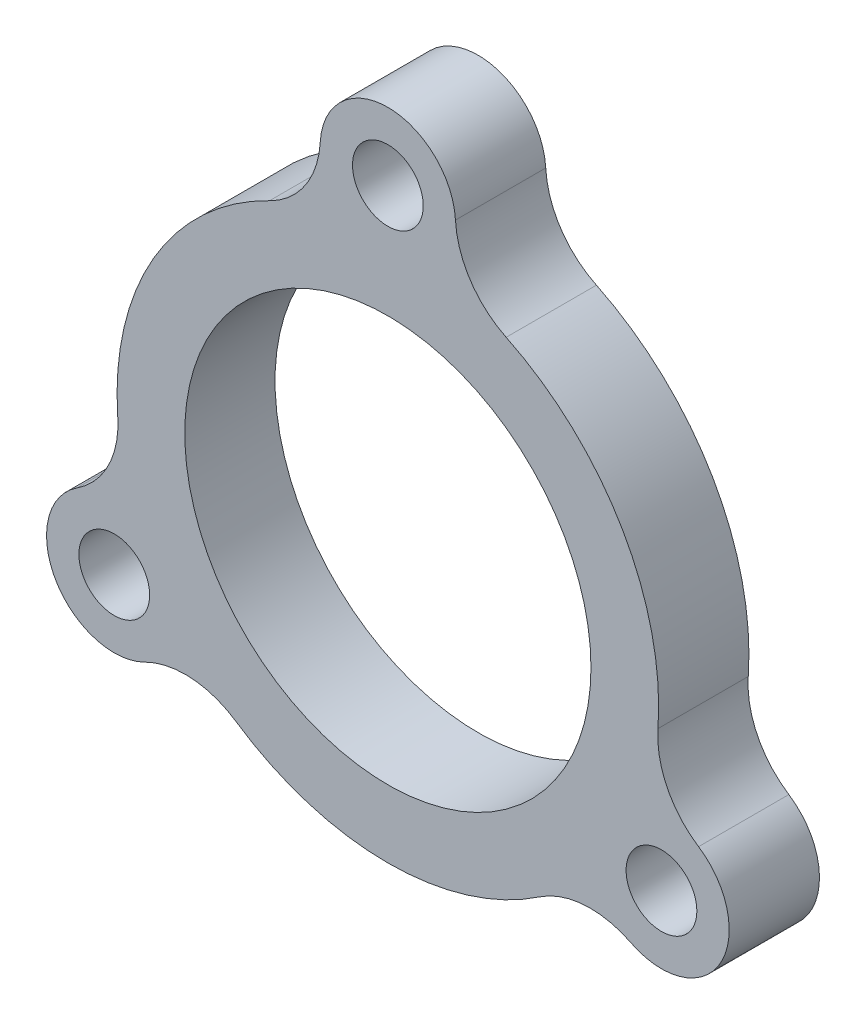
ISO-10303-21;
HEADER;
FILE_DESCRIPTION(('STEP AP214'),'2;1');
FILE_NAME('part.step','',(''),(''),'','','');
FILE_SCHEMA(('AUTOMOTIVE_DESIGN { 1 0 10303 214 1 1 1 1 }'));
ENDSEC;
DATA;
#1=APPLICATION_CONTEXT('core data for automotive mechanical design processes');
#2=APPLICATION_PROTOCOL_DEFINITION('international standard','automotive_design',2000,#1);
#3=PRODUCT_CONTEXT('',#1,'mechanical');
#4=PRODUCT('Part','Part','',(#3));
#5=PRODUCT_RELATED_PRODUCT_CATEGORY('part','',(#4));
#6=PRODUCT_DEFINITION_FORMATION('','',#4);
#7=PRODUCT_DEFINITION_CONTEXT('part definition',#1,'design');
#8=PRODUCT_DEFINITION('design','',#6,#7);
#9=PRODUCT_DEFINITION_SHAPE('','',#8);
#10=(LENGTH_UNIT() NAMED_UNIT(*) SI_UNIT(.MILLI.,.METRE.));
#11=(NAMED_UNIT(*) PLANE_ANGLE_UNIT() SI_UNIT($,.RADIAN.));
#12=(NAMED_UNIT(*) SI_UNIT($,.STERADIAN.) SOLID_ANGLE_UNIT());
#13=UNCERTAINTY_MEASURE_WITH_UNIT(LENGTH_MEASURE(1.E-05),#10,'distance_accuracy_value','');
#14=(GEOMETRIC_REPRESENTATION_CONTEXT(3) GLOBAL_UNCERTAINTY_ASSIGNED_CONTEXT((#13)) GLOBAL_UNIT_ASSIGNED_CONTEXT((#10,
#11,#12)) REPRESENTATION_CONTEXT('',''));
#15=CARTESIAN_POINT('',(0.,0.,0.));
#16=DIRECTION('',(0.,0.,1.));
#17=DIRECTION('',(1.,0.,0.));
#18=AXIS2_PLACEMENT_3D('',#15,#16,#17);
#19=CARTESIAN_POINT('',(-19.2474145991091,-11.1125,6.35));
#20=DIRECTION('',(0.,0.,-1.));
#21=DIRECTION('',(-1.,0.,0.));
#22=AXIS2_PLACEMENT_3D('',#19,#20,#21);
#23=CYLINDRICAL_SURFACE('',#22,4.7625);
#24=CARTESIAN_POINT('',(-19.2474145991091,-11.1125,6.35));
#25=DIRECTION('',(0.,0.,1.));
#26=DIRECTION('',(1.,0.,0.));
#27=AXIS2_PLACEMENT_3D('',#24,#25,#26);
#28=CIRCLE('',#27,4.7625);
#29=CARTESIAN_POINT('',(-21.8563855044312,-7.1281961630439,6.35));
#30=VERTEX_POINT('',#29);
#31=CARTESIAN_POINT('',(-17.1013917125704,-15.3640870002214,6.35));
#32=VERTEX_POINT('',#31);
#33=EDGE_CURVE('E144',#30,#32,#28,.T.);
#34=ORIENTED_EDGE('',*,*,#33,.F.);
#35=DIRECTION('',(0.,0.,-1.));
#36=VECTOR('',#35,1.);
#37=CARTESIAN_POINT('',(-21.8563855044312,-7.1281961630439,6.35));
#38=LINE('',#37,#36);
#39=CARTESIAN_POINT('',(-21.8563855044312,-7.1281961630439,0.));
#40=VERTEX_POINT('',#39);
#41=EDGE_CURVE('E131',#30,#40,#38,.T.);
#42=ORIENTED_EDGE('',*,*,#41,.T.);
#43=CARTESIAN_POINT('',(-19.2474145991091,-11.1125,0.));
#44=DIRECTION('',(0.,0.,1.));
#45=DIRECTION('',(1.,0.,0.));
#46=AXIS2_PLACEMENT_3D('',#43,#44,#45);
#47=CIRCLE('',#46,4.7625);
#48=CARTESIAN_POINT('',(-17.1013917125704,-15.3640870002214,0.));
#49=VERTEX_POINT('',#48);
#50=EDGE_CURVE('E142',#40,#49,#47,.T.);
#51=ORIENTED_EDGE('',*,*,#50,.T.);
#52=DIRECTION('',(0.,0.,-1.));
#53=VECTOR('',#52,1.);
#54=CARTESIAN_POINT('',(-17.1013917125704,-15.3640870002214,6.35));
#55=LINE('',#54,#53);
#56=EDGE_CURVE('E146',#49,#32,#55,.F.);
#57=ORIENTED_EDGE('',*,*,#56,.T.);
#58=EDGE_LOOP('',(#34,#42,#51,#57));
#59=FACE_BOUND('',#58,.T.);
#60=ADVANCED_FACE('F37',(#59),#23,.T.);
#61=CARTESIAN_POINT('',(0.,0.,6.35));
#62=DIRECTION('',(0.,0.,-1.));
#63=DIRECTION('',(-1.,0.,0.));
#64=AXIS2_PLACEMENT_3D('',#61,#62,#63);
#65=CYLINDRICAL_SURFACE('',#64,19.05);
#66=CARTESIAN_POINT('',(0.,0.,0.));
#67=DIRECTION('',(0.,0.,1.));
#68=DIRECTION('',(1.,0.,0.));
#69=AXIS2_PLACEMENT_3D('',#66,#67,#68);
#70=CIRCLE('',#69,19.05);
#71=CARTESIAN_POINT('',(-10.680020897889,-15.7746522503875,0.));
#72=VERTEX_POINT('',#71);
#73=CARTESIAN_POINT('',(10.680020897889,-15.7746522503875,0.));
#74=VERTEX_POINT('',#73);
#75=EDGE_CURVE('E152',#72,#74,#70,.T.);
#76=ORIENTED_EDGE('',*,*,#75,.T.);
#77=DIRECTION('',(0.,0.,-1.));
#78=VECTOR('',#77,1.);
#79=CARTESIAN_POINT('',(10.680020897889,-15.7746522503875,6.35));
#80=LINE('',#79,#78);
#81=CARTESIAN_POINT('',(10.680020897889,-15.7746522503875,6.35));
#82=VERTEX_POINT('',#81);
#83=EDGE_CURVE('E52',#74,#82,#80,.F.);
#84=ORIENTED_EDGE('',*,*,#83,.T.);
#85=CARTESIAN_POINT('',(0.,0.,6.35));
#86=DIRECTION('',(0.,0.,1.));
#87=DIRECTION('',(1.,0.,0.));
#88=AXIS2_PLACEMENT_3D('',#85,#86,#87);
#89=CIRCLE('',#88,19.05);
#90=CARTESIAN_POINT('',(-10.680020897889,-15.7746522503875,6.35));
#91=VERTEX_POINT('',#90);
#92=EDGE_CURVE('E243',#91,#82,#89,.T.);
#93=ORIENTED_EDGE('',*,*,#92,.F.);
#94=DIRECTION('',(0.,0.,-1.));
#95=VECTOR('',#94,1.);
#96=CARTESIAN_POINT('',(-10.680020897889,-15.7746522503875,6.35));
#97=LINE('',#96,#95);
#98=EDGE_CURVE('E198',#91,#72,#97,.T.);
#99=ORIENTED_EDGE('',*,*,#98,.T.);
#100=EDGE_LOOP('',(#76,#84,#93,#99));
#101=FACE_BOUND('',#100,.T.);
#102=ADVANCED_FACE('F270',(#101),#65,.T.);
#103=CARTESIAN_POINT('',(19.2474145991092,-11.1125,6.35));
#104=DIRECTION('',(0.,0.,-1.));
#105=DIRECTION('',(-1.,0.,0.));
#106=AXIS2_PLACEMENT_3D('',#103,#104,#105);
#107=CYLINDRICAL_SURFACE('',#106,4.7625);
#108=CARTESIAN_POINT('',(19.2474145991092,-11.1125,0.));
#109=DIRECTION('',(0.,0.,1.));
#110=DIRECTION('',(1.,0.,0.));
#111=AXIS2_PLACEMENT_3D('',#108,#109,#110);
#112=CIRCLE('',#111,4.7625);
#113=CARTESIAN_POINT('',(17.1013917125704,-15.3640870002214,0.));
#114=VERTEX_POINT('',#113);
#115=CARTESIAN_POINT('',(21.8563855044312,-7.12819616304389,0.));
#116=VERTEX_POINT('',#115);
#117=EDGE_CURVE('E155',#114,#116,#112,.T.);
#118=ORIENTED_EDGE('',*,*,#117,.T.);
#119=DIRECTION('',(0.,0.,-1.));
#120=VECTOR('',#119,1.);
#121=CARTESIAN_POINT('',(21.8563855044312,-7.12819616304389,6.35));
#122=LINE('',#121,#120);
#123=CARTESIAN_POINT('',(21.8563855044312,-7.12819616304389,6.35));
#124=VERTEX_POINT('',#123);
#125=EDGE_CURVE('E196',#116,#124,#122,.F.);
#126=ORIENTED_EDGE('',*,*,#125,.T.);
#127=CARTESIAN_POINT('',(19.2474145991092,-11.1125,6.35));
#128=DIRECTION('',(0.,0.,1.));
#129=DIRECTION('',(1.,0.,0.));
#130=AXIS2_PLACEMENT_3D('',#127,#128,#129);
#131=CIRCLE('',#130,4.7625);
#132=CARTESIAN_POINT('',(17.1013917125704,-15.3640870002214,6.35));
#133=VERTEX_POINT('',#132);
#134=EDGE_CURVE('E244',#133,#124,#131,.T.);
#135=ORIENTED_EDGE('',*,*,#134,.F.);
#136=DIRECTION('',(0.,0.,-1.));
#137=VECTOR('',#136,1.);
#138=CARTESIAN_POINT('',(17.1013917125704,-15.3640870002214,6.35));
#139=LINE('',#138,#137);
#140=EDGE_CURVE('E193',#133,#114,#139,.T.);
#141=ORIENTED_EDGE('',*,*,#140,.T.);
#142=EDGE_LOOP('',(#118,#126,#135,#141));
#143=FACE_BOUND('',#142,.T.);
#144=ADVANCED_FACE('F275',(#143),#107,.T.);
#145=CARTESIAN_POINT('',(19.0012600336454,-1.36184328532681,6.35));
#146=VERTEX_POINT('',#145);
#147=CARTESIAN_POINT('',(8.32123913575643,17.1364955357143,6.35));
#148=VERTEX_POINT('',#147);
#149=EDGE_CURVE('E235',#146,#148,#89,.T.);
#150=ORIENTED_EDGE('',*,*,#149,.F.);
#151=DIRECTION('',(0.,0.,-1.));
#152=VECTOR('',#151,1.);
#153=CARTESIAN_POINT('',(19.0012600336454,-1.36184328532681,6.35));
#154=LINE('',#153,#152);
#155=CARTESIAN_POINT('',(19.0012600336454,-1.36184328532681,0.));
#156=VERTEX_POINT('',#155);
#157=EDGE_CURVE('E190',#146,#156,#154,.T.);
#158=ORIENTED_EDGE('',*,*,#157,.T.);
#159=CARTESIAN_POINT('',(8.32123913575643,17.1364955357143,0.));
#160=VERTEX_POINT('',#159);
#161=EDGE_CURVE('E157',#156,#160,#70,.T.);
#162=ORIENTED_EDGE('',*,*,#161,.T.);
#163=DIRECTION('',(0.,0.,-1.));
#164=VECTOR('',#163,1.);
#165=CARTESIAN_POINT('',(8.32123913575643,17.1364955357143,6.35));
#166=LINE('',#165,#164);
#167=EDGE_CURVE('E188',#160,#148,#166,.F.);
#168=ORIENTED_EDGE('',*,*,#167,.T.);
#169=EDGE_LOOP('',(#150,#158,#162,#168));
#170=FACE_BOUND('',#169,.T.);
#171=ADVANCED_FACE('F224',(#170),#65,.T.);
#172=CARTESIAN_POINT('',(0.,22.225,6.35));
#173=DIRECTION('',(0.,0.,-1.));
#174=DIRECTION('',(-1.,0.,0.));
#175=AXIS2_PLACEMENT_3D('',#172,#173,#174);
#176=CYLINDRICAL_SURFACE('',#175,4.7625);
#177=CARTESIAN_POINT('',(0.,22.225,0.));
#178=DIRECTION('',(0.,0.,1.));
#179=DIRECTION('',(1.,0.,0.));
#180=AXIS2_PLACEMENT_3D('',#177,#178,#179);
#181=CIRCLE('',#180,4.7625);
#182=CARTESIAN_POINT('',(4.75499379186081,22.4922831632653,0.));
#183=VERTEX_POINT('',#182);
#184=CARTESIAN_POINT('',(-4.75499379186081,22.4922831632653,0.));
#185=VERTEX_POINT('',#184);
#186=EDGE_CURVE('E165',#183,#185,#181,.T.);
#187=ORIENTED_EDGE('',*,*,#186,.T.);
#188=DIRECTION('',(0.,0.,-1.));
#189=VECTOR('',#188,1.);
#190=CARTESIAN_POINT('',(-4.75499379186081,22.4922831632653,6.35));
#191=LINE('',#190,#189);
#192=CARTESIAN_POINT('',(-4.75499379186081,22.4922831632653,6.35));
#193=VERTEX_POINT('',#192);
#194=EDGE_CURVE('E186',#185,#193,#191,.F.);
#195=ORIENTED_EDGE('',*,*,#194,.T.);
#196=CARTESIAN_POINT('',(0.,22.225,6.35));
#197=DIRECTION('',(0.,0.,1.));
#198=DIRECTION('',(1.,0.,0.));
#199=AXIS2_PLACEMENT_3D('',#196,#197,#198);
#200=CIRCLE('',#199,4.7625);
#201=CARTESIAN_POINT('',(4.75499379186081,22.4922831632653,6.35));
#202=VERTEX_POINT('',#201);
#203=EDGE_CURVE('E233',#202,#193,#200,.T.);
#204=ORIENTED_EDGE('',*,*,#203,.F.);
#205=DIRECTION('',(0.,0.,-1.));
#206=VECTOR('',#205,1.);
#207=CARTESIAN_POINT('',(4.75499379186081,22.4922831632653,6.35));
#208=LINE('',#207,#206);
#209=EDGE_CURVE('E183',#202,#183,#208,.T.);
#210=ORIENTED_EDGE('',*,*,#209,.T.);
#211=EDGE_LOOP('',(#187,#195,#204,#210));
#212=FACE_BOUND('',#211,.T.);
#213=ADVANCED_FACE('F237',(#212),#176,.T.);
#214=CARTESIAN_POINT('',(0.,22.225,6.35));
#215=DIRECTION('',(0.,0.,-1.));
#216=DIRECTION('',(-1.,0.,0.));
#217=AXIS2_PLACEMENT_3D('',#214,#215,#216);
#218=CYLINDRICAL_SURFACE('',#217,2.4892);
#219=CARTESIAN_POINT('',(0.,22.225,6.35));
#220=DIRECTION('',(0.,0.,1.));
#221=DIRECTION('',(1.,0.,0.));
#222=AXIS2_PLACEMENT_3D('',#219,#220,#221);
#223=CIRCLE('',#222,2.4892);
#224=CARTESIAN_POINT('',(2.4892,22.225,6.35));
#225=VERTEX_POINT('',#224);
#226=EDGE_CURVE('E249',#225,#225,#223,.T.);
#227=ORIENTED_EDGE('',*,*,#226,.T.);
#228=EDGE_LOOP('',(#227));
#229=FACE_BOUND('',#228,.T.);
#230=CARTESIAN_POINT('',(0.,22.225,0.));
#231=DIRECTION('',(0.,0.,1.));
#232=DIRECTION('',(1.,0.,0.));
#233=AXIS2_PLACEMENT_3D('',#230,#231,#232);
#234=CIRCLE('',#233,2.4892);
#235=CARTESIAN_POINT('',(2.4892,22.225,0.));
#236=VERTEX_POINT('',#235);
#237=EDGE_CURVE('E171',#236,#236,#234,.T.);
#238=ORIENTED_EDGE('',*,*,#237,.F.);
#239=EDGE_LOOP('',(#238));
#240=FACE_BOUND('',#239,.T.);
#241=ADVANCED_FACE('F325',(#229,#240),#218,.F.);
#242=CARTESIAN_POINT('',(0.,0.,6.35));
#243=DIRECTION('',(0.,0.,-1.));
#244=DIRECTION('',(-1.,0.,0.));
#245=AXIS2_PLACEMENT_3D('',#242,#243,#244);
#246=CYLINDRICAL_SURFACE('',#245,14.2875);
#247=CARTESIAN_POINT('',(0.,0.,6.35));
#248=DIRECTION('',(0.,0.,1.));
#249=DIRECTION('',(1.,0.,0.));
#250=AXIS2_PLACEMENT_3D('',#247,#248,#249);
#251=CIRCLE('',#250,14.2875);
#252=CARTESIAN_POINT('',(14.2875,0.,6.35));
#253=VERTEX_POINT('',#252);
#254=EDGE_CURVE('E241',#253,#253,#251,.T.);
#255=ORIENTED_EDGE('',*,*,#254,.T.);
#256=EDGE_LOOP('',(#255));
#257=FACE_BOUND('',#256,.T.);
#258=CARTESIAN_POINT('',(0.,0.,0.));
#259=DIRECTION('',(0.,0.,1.));
#260=DIRECTION('',(1.,0.,0.));
#261=AXIS2_PLACEMENT_3D('',#258,#259,#260);
#262=CIRCLE('',#261,14.2875);
#263=CARTESIAN_POINT('',(14.2875,0.,0.));
#264=VERTEX_POINT('',#263);
#265=EDGE_CURVE('E168',#264,#264,#262,.T.);
#266=ORIENTED_EDGE('',*,*,#265,.F.);
#267=EDGE_LOOP('',(#266));
#268=FACE_BOUND('',#267,.T.);
#269=ADVANCED_FACE('F321',(#257,#268),#246,.F.);
#270=CARTESIAN_POINT('',(-8.32123913575643,17.1364955357143,0.));
#271=VERTEX_POINT('',#270);
#272=CARTESIAN_POINT('',(-19.0012600336454,-1.36184328532682,0.));
#273=VERTEX_POINT('',#272);
#274=EDGE_CURVE('E158',#271,#273,#70,.T.);
#275=ORIENTED_EDGE('',*,*,#274,.T.);
#276=DIRECTION('',(0.,0.,-1.));
#277=VECTOR('',#276,1.);
#278=CARTESIAN_POINT('',(-19.0012600336454,-1.36184328532682,6.35));
#279=LINE('',#278,#277);
#280=CARTESIAN_POINT('',(-19.0012600336454,-1.36184328532682,6.35));
#281=VERTEX_POINT('',#280);
#282=EDGE_CURVE('E132',#273,#281,#279,.F.);
#283=ORIENTED_EDGE('',*,*,#282,.T.);
#284=CARTESIAN_POINT('',(-8.32123913575643,17.1364955357143,6.35));
#285=VERTEX_POINT('',#284);
#286=EDGE_CURVE('E239',#285,#281,#89,.T.);
#287=ORIENTED_EDGE('',*,*,#286,.F.);
#288=DIRECTION('',(0.,0.,-1.));
#289=VECTOR('',#288,1.);
#290=CARTESIAN_POINT('',(-8.32123913575643,17.1364955357143,6.35));
#291=LINE('',#290,#289);
#292=EDGE_CURVE('E145',#285,#271,#291,.T.);
#293=ORIENTED_EDGE('',*,*,#292,.T.);
#294=EDGE_LOOP('',(#275,#283,#287,#293));
#295=FACE_BOUND('',#294,.T.);
#296=ADVANCED_FACE('F277',(#295),#65,.T.);
#297=CARTESIAN_POINT('',(-19.2474145991091,-11.1125,6.35));
#298=DIRECTION('',(0.,0.,-1.));
#299=DIRECTION('',(-1.,0.,0.));
#300=AXIS2_PLACEMENT_3D('',#297,#298,#299);
#301=CYLINDRICAL_SURFACE('',#300,2.4892);
#302=CARTESIAN_POINT('',(-19.2474145991091,-11.1125,6.35));
#303=DIRECTION('',(0.,0.,1.));
#304=DIRECTION('',(1.,0.,0.));
#305=AXIS2_PLACEMENT_3D('',#302,#303,#304);
#306=CIRCLE('',#305,2.4892);
#307=CARTESIAN_POINT('',(-16.7582145991091,-11.1125,6.35));
#308=VERTEX_POINT('',#307);
#309=EDGE_CURVE('E177',#308,#308,#306,.T.);
#310=ORIENTED_EDGE('',*,*,#309,.T.);
#311=EDGE_LOOP('',(#310));
#312=FACE_BOUND('',#311,.T.);
#313=CARTESIAN_POINT('',(-19.2474145991091,-11.1125,0.));
#314=DIRECTION('',(0.,0.,1.));
#315=DIRECTION('',(1.,0.,0.));
#316=AXIS2_PLACEMENT_3D('',#313,#314,#315);
#317=CIRCLE('',#316,2.4892);
#318=CARTESIAN_POINT('',(-16.7582145991091,-11.1125,0.));
#319=VERTEX_POINT('',#318);
#320=EDGE_CURVE('E153',#319,#319,#317,.T.);
#321=ORIENTED_EDGE('',*,*,#320,.F.);
#322=EDGE_LOOP('',(#321));
#323=FACE_BOUND('',#322,.T.);
#324=ADVANCED_FACE('F266',(#312,#323),#301,.F.);
#325=CARTESIAN_POINT('',(19.2474145991092,-11.1125,6.35));
#326=DIRECTION('',(0.,0.,-1.));
#327=DIRECTION('',(-1.,0.,0.));
#328=AXIS2_PLACEMENT_3D('',#325,#326,#327);
#329=CYLINDRICAL_SURFACE('',#328,2.4892);
#330=CARTESIAN_POINT('',(19.2474145991092,-11.1125,6.35));
#331=DIRECTION('',(0.,0.,1.));
#332=DIRECTION('',(1.,0.,0.));
#333=AXIS2_PLACEMENT_3D('',#330,#331,#332);
#334=CIRCLE('',#333,2.4892);
#335=CARTESIAN_POINT('',(21.7366145991092,-11.1125,6.35));
#336=VERTEX_POINT('',#335);
#337=EDGE_CURVE('E178',#336,#336,#334,.T.);
#338=ORIENTED_EDGE('',*,*,#337,.T.);
#339=EDGE_LOOP('',(#338));
#340=FACE_BOUND('',#339,.T.);
#341=CARTESIAN_POINT('',(19.2474145991092,-11.1125,0.));
#342=DIRECTION('',(0.,0.,1.));
#343=DIRECTION('',(1.,0.,0.));
#344=AXIS2_PLACEMENT_3D('',#341,#342,#343);
#345=CIRCLE('',#344,2.4892);
#346=CARTESIAN_POINT('',(21.7366145991092,-11.1125,0.));
#347=VERTEX_POINT('',#346);
#348=EDGE_CURVE('E174',#347,#347,#345,.T.);
#349=ORIENTED_EDGE('',*,*,#348,.F.);
#350=EDGE_LOOP('',(#349));
#351=FACE_BOUND('',#350,.T.);
#352=ADVANCED_FACE('F254',(#340,#351),#329,.F.);
#353=CARTESIAN_POINT('',(0.,0.,6.35));
#354=DIRECTION('',(0.,0.,1.));
#355=DIRECTION('',(1.,0.,0.));
#356=AXIS2_PLACEMENT_3D('',#353,#354,#355);
#357=PLANE('',#356);
#358=ORIENTED_EDGE('',*,*,#309,.F.);
#359=EDGE_LOOP('',(#358));
#360=FACE_BOUND('',#359,.T.);
#361=ORIENTED_EDGE('',*,*,#286,.T.);
#362=CARTESIAN_POINT('',(-25.3350133781939,-1.81579104710243,6.35));
#363=DIRECTION('',(0.,0.,1.));
#364=DIRECTION('',(1.,0.,0.));
#365=AXIS2_PLACEMENT_3D('',#362,#363,#364);
#366=CIRCLE('',#365,6.35);
#367=EDGE_CURVE('E137',#281,#30,#366,.F.);
#368=ORIENTED_EDGE('',*,*,#367,.T.);
#369=ORIENTED_EDGE('',*,*,#33,.T.);
#370=CARTESIAN_POINT('',(-14.240027863852,-21.0328696671833,6.35));
#371=DIRECTION('',(0.,0.,1.));
#372=DIRECTION('',(1.,0.,0.));
#373=AXIS2_PLACEMENT_3D('',#370,#371,#372);
#374=CIRCLE('',#373,6.35);
#375=EDGE_CURVE('E59',#32,#91,#374,.F.);
#376=ORIENTED_EDGE('',*,*,#375,.T.);
#377=ORIENTED_EDGE('',*,*,#92,.T.);
#378=CARTESIAN_POINT('',(14.240027863852,-21.0328696671833,6.35));
#379=DIRECTION('',(0.,0.,1.));
#380=DIRECTION('',(1.,0.,0.));
#381=AXIS2_PLACEMENT_3D('',#378,#379,#380);
#382=CIRCLE('',#381,6.35);
#383=EDGE_CURVE('E213',#82,#133,#382,.F.);
#384=ORIENTED_EDGE('',*,*,#383,.T.);
#385=ORIENTED_EDGE('',*,*,#134,.T.);
#386=CARTESIAN_POINT('',(25.3350133781939,-1.81579104710241,6.35));
#387=DIRECTION('',(0.,0.,1.));
#388=DIRECTION('',(1.,0.,0.));
#389=AXIS2_PLACEMENT_3D('',#386,#387,#388);
#390=CIRCLE('',#389,6.35);
#391=EDGE_CURVE('E209',#124,#146,#390,.F.);
#392=ORIENTED_EDGE('',*,*,#391,.T.);
#393=ORIENTED_EDGE('',*,*,#149,.T.);
#394=CARTESIAN_POINT('',(11.0949855143419,22.8486607142857,6.35));
#395=DIRECTION('',(0.,0.,1.));
#396=DIRECTION('',(1.,0.,0.));
#397=AXIS2_PLACEMENT_3D('',#394,#395,#396);
#398=CIRCLE('',#397,6.35);
#399=EDGE_CURVE('E11',#148,#202,#398,.F.);
#400=ORIENTED_EDGE('',*,*,#399,.T.);
#401=ORIENTED_EDGE('',*,*,#203,.T.);
#402=CARTESIAN_POINT('',(-11.0949855143419,22.8486607142857,6.35));
#403=DIRECTION('',(0.,0.,1.));
#404=DIRECTION('',(1.,0.,0.));
#405=AXIS2_PLACEMENT_3D('',#402,#403,#404);
#406=CIRCLE('',#405,6.35);
#407=EDGE_CURVE('E205',#193,#285,#406,.F.);
#408=ORIENTED_EDGE('',*,*,#407,.T.);
#409=EDGE_LOOP('',(#361,#368,#369,#376,#377,#384,#385,#392,#393,#400,#401,#408));
#410=FACE_BOUND('',#409,.T.);
#411=ORIENTED_EDGE('',*,*,#254,.F.);
#412=EDGE_LOOP('',(#411));
#413=FACE_BOUND('',#412,.T.);
#414=ORIENTED_EDGE('',*,*,#226,.F.);
#415=EDGE_LOOP('',(#414));
#416=FACE_BOUND('',#415,.T.);
#417=ORIENTED_EDGE('',*,*,#337,.F.);
#418=EDGE_LOOP('',(#417));
#419=FACE_BOUND('',#418,.T.);
#420=ADVANCED_FACE('F231',(#360,#410,#413,#416,#419),#357,.T.);
#421=CARTESIAN_POINT('',(0.,0.,0.));
#422=DIRECTION('',(0.,0.,1.));
#423=DIRECTION('',(1.,0.,0.));
#424=AXIS2_PLACEMENT_3D('',#421,#422,#423);
#425=PLANE('',#424);
#426=ORIENTED_EDGE('',*,*,#320,.T.);
#427=EDGE_LOOP('',(#426));
#428=FACE_BOUND('',#427,.T.);
#429=ORIENTED_EDGE('',*,*,#50,.F.);
#430=CARTESIAN_POINT('',(-25.3350133781939,-1.81579104710243,0.));
#431=DIRECTION('',(0.,0.,1.));
#432=DIRECTION('',(1.,0.,0.));
#433=AXIS2_PLACEMENT_3D('',#430,#431,#432);
#434=CIRCLE('',#433,6.35);
#435=EDGE_CURVE('E127',#40,#273,#434,.T.);
#436=ORIENTED_EDGE('',*,*,#435,.T.);
#437=ORIENTED_EDGE('',*,*,#274,.F.);
#438=CARTESIAN_POINT('',(-11.0949855143419,22.8486607142857,0.));
#439=DIRECTION('',(0.,0.,1.));
#440=DIRECTION('',(1.,0.,0.));
#441=AXIS2_PLACEMENT_3D('',#438,#439,#440);
#442=CIRCLE('',#441,6.35);
#443=EDGE_CURVE('E203',#271,#185,#442,.T.);
#444=ORIENTED_EDGE('',*,*,#443,.T.);
#445=ORIENTED_EDGE('',*,*,#186,.F.);
#446=CARTESIAN_POINT('',(11.0949855143419,22.8486607142857,0.));
#447=DIRECTION('',(0.,0.,1.));
#448=DIRECTION('',(1.,0.,0.));
#449=AXIS2_PLACEMENT_3D('',#446,#447,#448);
#450=CIRCLE('',#449,6.35);
#451=EDGE_CURVE('E45',#183,#160,#450,.T.);
#452=ORIENTED_EDGE('',*,*,#451,.T.);
#453=ORIENTED_EDGE('',*,*,#161,.F.);
#454=CARTESIAN_POINT('',(25.3350133781939,-1.81579104710241,0.));
#455=DIRECTION('',(0.,0.,1.));
#456=DIRECTION('',(1.,0.,0.));
#457=AXIS2_PLACEMENT_3D('',#454,#455,#456);
#458=CIRCLE('',#457,6.35);
#459=EDGE_CURVE('E207',#156,#116,#458,.T.);
#460=ORIENTED_EDGE('',*,*,#459,.T.);
#461=ORIENTED_EDGE('',*,*,#117,.F.);
#462=CARTESIAN_POINT('',(14.240027863852,-21.0328696671833,0.));
#463=DIRECTION('',(0.,0.,1.));
#464=DIRECTION('',(1.,0.,0.));
#465=AXIS2_PLACEMENT_3D('',#462,#463,#464);
#466=CIRCLE('',#465,6.35);
#467=EDGE_CURVE('E211',#114,#74,#466,.T.);
#468=ORIENTED_EDGE('',*,*,#467,.T.);
#469=ORIENTED_EDGE('',*,*,#75,.F.);
#470=CARTESIAN_POINT('',(-14.240027863852,-21.0328696671833,0.));
#471=DIRECTION('',(0.,0.,1.));
#472=DIRECTION('',(1.,0.,0.));
#473=AXIS2_PLACEMENT_3D('',#470,#471,#472);
#474=CIRCLE('',#473,6.35);
#475=EDGE_CURVE('E151',#72,#49,#474,.T.);
#476=ORIENTED_EDGE('',*,*,#475,.T.);
#477=EDGE_LOOP('',(#429,#436,#437,#444,#445,#452,#453,#460,#461,#468,#469,#476));
#478=FACE_BOUND('',#477,.T.);
#479=ORIENTED_EDGE('',*,*,#265,.T.);
#480=EDGE_LOOP('',(#479));
#481=FACE_BOUND('',#480,.T.);
#482=ORIENTED_EDGE('',*,*,#237,.T.);
#483=EDGE_LOOP('',(#482));
#484=FACE_BOUND('',#483,.T.);
#485=ORIENTED_EDGE('',*,*,#348,.T.);
#486=EDGE_LOOP('',(#485));
#487=FACE_BOUND('',#486,.T.);
#488=ADVANCED_FACE('F148',(#428,#478,#481,#484,#487),#425,.F.);
#489=CARTESIAN_POINT('',(-25.3350133781939,-1.81579104710243,6.35));
#490=DIRECTION('',(0.,0.,1.));
#491=DIRECTION('',(1.,0.,0.));
#492=AXIS2_PLACEMENT_3D('',#489,#490,#491);
#493=CYLINDRICAL_SURFACE('',#492,6.35);
#494=ORIENTED_EDGE('',*,*,#367,.F.);
#495=ORIENTED_EDGE('',*,*,#282,.F.);
#496=ORIENTED_EDGE('',*,*,#435,.F.);
#497=ORIENTED_EDGE('',*,*,#41,.F.);
#498=EDGE_LOOP('',(#494,#495,#496,#497));
#499=FACE_BOUND('',#498,.T.);
#500=ADVANCED_FACE('F130',(#499),#493,.F.);
#501=CARTESIAN_POINT('',(-11.0949855143419,22.8486607142857,6.35));
#502=DIRECTION('',(0.,0.,1.));
#503=DIRECTION('',(1.,0.,0.));
#504=AXIS2_PLACEMENT_3D('',#501,#502,#503);
#505=CYLINDRICAL_SURFACE('',#504,6.35);
#506=ORIENTED_EDGE('',*,*,#407,.F.);
#507=ORIENTED_EDGE('',*,*,#194,.F.);
#508=ORIENTED_EDGE('',*,*,#443,.F.);
#509=ORIENTED_EDGE('',*,*,#292,.F.);
#510=EDGE_LOOP('',(#506,#507,#508,#509));
#511=FACE_BOUND('',#510,.T.);
#512=ADVANCED_FACE('F286',(#511),#505,.F.);
#513=CARTESIAN_POINT('',(25.3350133781939,-1.81579104710241,6.35));
#514=DIRECTION('',(0.,0.,1.));
#515=DIRECTION('',(1.,0.,0.));
#516=AXIS2_PLACEMENT_3D('',#513,#514,#515);
#517=CYLINDRICAL_SURFACE('',#516,6.35);
#518=ORIENTED_EDGE('',*,*,#391,.F.);
#519=ORIENTED_EDGE('',*,*,#125,.F.);
#520=ORIENTED_EDGE('',*,*,#459,.F.);
#521=ORIENTED_EDGE('',*,*,#157,.F.);
#522=EDGE_LOOP('',(#518,#519,#520,#521));
#523=FACE_BOUND('',#522,.T.);
#524=ADVANCED_FACE('F289',(#523),#517,.F.);
#525=CARTESIAN_POINT('',(14.240027863852,-21.0328696671833,6.35));
#526=DIRECTION('',(0.,0.,1.));
#527=DIRECTION('',(1.,0.,0.));
#528=AXIS2_PLACEMENT_3D('',#525,#526,#527);
#529=CYLINDRICAL_SURFACE('',#528,6.35);
#530=ORIENTED_EDGE('',*,*,#383,.F.);
#531=ORIENTED_EDGE('',*,*,#83,.F.);
#532=ORIENTED_EDGE('',*,*,#467,.F.);
#533=ORIENTED_EDGE('',*,*,#140,.F.);
#534=EDGE_LOOP('',(#530,#531,#532,#533));
#535=FACE_BOUND('',#534,.T.);
#536=ADVANCED_FACE('F293',(#535),#529,.F.);
#537=CARTESIAN_POINT('',(-14.240027863852,-21.0328696671833,6.35));
#538=DIRECTION('',(0.,0.,1.));
#539=DIRECTION('',(1.,0.,0.));
#540=AXIS2_PLACEMENT_3D('',#537,#538,#539);
#541=CYLINDRICAL_SURFACE('',#540,6.35);
#542=ORIENTED_EDGE('',*,*,#375,.F.);
#543=ORIENTED_EDGE('',*,*,#56,.F.);
#544=ORIENTED_EDGE('',*,*,#475,.F.);
#545=ORIENTED_EDGE('',*,*,#98,.F.);
#546=EDGE_LOOP('',(#542,#543,#544,#545));
#547=FACE_BOUND('',#546,.T.);
#548=ADVANCED_FACE('F296',(#547),#541,.F.);
#549=CARTESIAN_POINT('',(11.0949855143419,22.8486607142857,6.35));
#550=DIRECTION('',(0.,0.,1.));
#551=DIRECTION('',(1.,0.,0.));
#552=AXIS2_PLACEMENT_3D('',#549,#550,#551);
#553=CYLINDRICAL_SURFACE('',#552,6.35);
#554=ORIENTED_EDGE('',*,*,#399,.F.);
#555=ORIENTED_EDGE('',*,*,#167,.F.);
#556=ORIENTED_EDGE('',*,*,#451,.F.);
#557=ORIENTED_EDGE('',*,*,#209,.F.);
#558=EDGE_LOOP('',(#554,#555,#556,#557));
#559=FACE_BOUND('',#558,.T.);
#560=ADVANCED_FACE('F39',(#559),#553,.F.);
#561=CLOSED_SHELL('',(#60,#102,#144,#171,#213,#241,#269,#296,#324,#352,#420,#488,#500,#512,#524,
#536,#548,#560));
#562=MANIFOLD_SOLID_BREP('B2',#561);
#563=ADVANCED_BREP_SHAPE_REPRESENTATION('',(#18,#562),#14);
#564=SHAPE_DEFINITION_REPRESENTATION(#9,#563);
ENDSEC;
END-ISO-10303-21;
